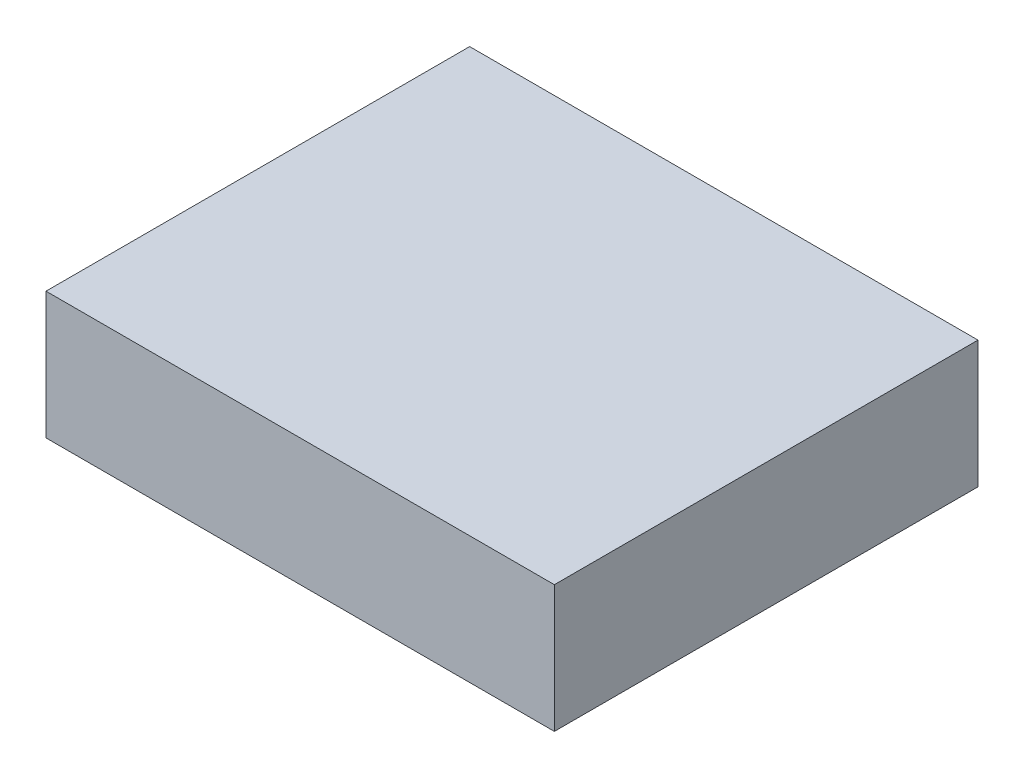
ISO-10303-21;
HEADER;
FILE_DESCRIPTION(('STEP AP214'),'2;1');
FILE_NAME('part.step','',(''),(''),'','','');
FILE_SCHEMA(('AUTOMOTIVE_DESIGN { 1 0 10303 214 1 1 1 1 }'));
ENDSEC;
DATA;
#1=APPLICATION_CONTEXT('core data for automotive mechanical design processes');
#2=APPLICATION_PROTOCOL_DEFINITION('international standard','automotive_design',2000,#1);
#3=PRODUCT_CONTEXT('',#1,'mechanical');
#4=PRODUCT('Part','Part','',(#3));
#5=PRODUCT_RELATED_PRODUCT_CATEGORY('part','',(#4));
#6=PRODUCT_DEFINITION_FORMATION('','',#4);
#7=PRODUCT_DEFINITION_CONTEXT('part definition',#1,'design');
#8=PRODUCT_DEFINITION('design','',#6,#7);
#9=PRODUCT_DEFINITION_SHAPE('','',#8);
#10=(LENGTH_UNIT() NAMED_UNIT(*) SI_UNIT(.MILLI.,.METRE.));
#11=(NAMED_UNIT(*) PLANE_ANGLE_UNIT() SI_UNIT($,.RADIAN.));
#12=(NAMED_UNIT(*) SI_UNIT($,.STERADIAN.) SOLID_ANGLE_UNIT());
#13=UNCERTAINTY_MEASURE_WITH_UNIT(LENGTH_MEASURE(1.E-05),#10,'distance_accuracy_value','');
#14=(GEOMETRIC_REPRESENTATION_CONTEXT(3) GLOBAL_UNCERTAINTY_ASSIGNED_CONTEXT((#13)) GLOBAL_UNIT_ASSIGNED_CONTEXT((#10,
#11,#12)) REPRESENTATION_CONTEXT('',''));
#15=CARTESIAN_POINT('',(0.,0.,0.));
#16=DIRECTION('',(0.,0.,1.));
#17=DIRECTION('',(1.,0.,0.));
#18=AXIS2_PLACEMENT_3D('',#15,#16,#17);
#19=CARTESIAN_POINT('',(-60.,0.,0.));
#20=DIRECTION('',(0.,0.,1.));
#21=DIRECTION('',(0.,-1.,0.));
#22=AXIS2_PLACEMENT_3D('',#19,#20,#21);
#23=PLANE('',#22);
#24=DIRECTION('',(1.,0.,0.));
#25=VECTOR('',#24,1.);
#26=CARTESIAN_POINT('',(-60.,-480.,0.));
#27=LINE('',#26,#25);
#28=CARTESIAN_POINT('',(-60.,-480.,0.));
#29=VERTEX_POINT('',#28);
#30=CARTESIAN_POINT('',(60.,-480.,0.));
#31=VERTEX_POINT('',#30);
#32=EDGE_CURVE('E42',#29,#31,#27,.T.);
#33=ORIENTED_EDGE('',*,*,#32,.T.);
#34=DIRECTION('',(0.,-1.,0.));
#35=VECTOR('',#34,1.);
#36=CARTESIAN_POINT('',(60.,0.,0.));
#37=LINE('',#36,#35);
#38=CARTESIAN_POINT('',(60.,-450.,0.));
#39=VERTEX_POINT('',#38);
#40=EDGE_CURVE('E82',#39,#31,#37,.T.);
#41=ORIENTED_EDGE('',*,*,#40,.F.);
#42=DIRECTION('',(1.,0.,0.));
#43=VECTOR('',#42,1.);
#44=CARTESIAN_POINT('',(-60.,-450.,0.));
#45=LINE('',#44,#43);
#46=CARTESIAN_POINT('',(-60.,-450.,0.));
#47=VERTEX_POINT('',#46);
#48=EDGE_CURVE('E11',#47,#39,#45,.T.);
#49=ORIENTED_EDGE('',*,*,#48,.F.);
#50=DIRECTION('',(0.,-1.,0.));
#51=VECTOR('',#50,1.);
#52=CARTESIAN_POINT('',(-60.,0.,0.));
#53=LINE('',#52,#51);
#54=EDGE_CURVE('E83',#47,#29,#53,.T.);
#55=ORIENTED_EDGE('',*,*,#54,.T.);
#56=EDGE_LOOP('',(#33,#41,#49,#55));
#57=FACE_BOUND('',#56,.T.);
#58=ADVANCED_FACE('F41',(#57),#23,.T.);
#59=CARTESIAN_POINT('',(-60.,-450.,0.));
#60=DIRECTION('',(0.,-1.,0.));
#61=DIRECTION('',(0.,0.,-1.));
#62=AXIS2_PLACEMENT_3D('',#59,#60,#61);
#63=PLANE('',#62);
#64=ORIENTED_EDGE('',*,*,#48,.T.);
#65=DIRECTION('',(0.,0.,-1.));
#66=VECTOR('',#65,1.);
#67=CARTESIAN_POINT('',(60.,-450.,0.));
#68=LINE('',#67,#66);
#69=CARTESIAN_POINT('',(60.,-450.,-100.));
#70=VERTEX_POINT('',#69);
#71=EDGE_CURVE('E97',#39,#70,#68,.T.);
#72=ORIENTED_EDGE('',*,*,#71,.T.);
#73=DIRECTION('',(1.,0.,0.));
#74=VECTOR('',#73,1.);
#75=CARTESIAN_POINT('',(-60.,-450.,-100.));
#76=LINE('',#75,#74);
#77=CARTESIAN_POINT('',(-60.,-450.,-100.));
#78=VERTEX_POINT('',#77);
#79=EDGE_CURVE('E47',#78,#70,#76,.T.);
#80=ORIENTED_EDGE('',*,*,#79,.F.);
#81=DIRECTION('',(0.,0.,-1.));
#82=VECTOR('',#81,1.);
#83=CARTESIAN_POINT('',(-60.,-450.,0.));
#84=LINE('',#83,#82);
#85=EDGE_CURVE('E61',#47,#78,#84,.T.);
#86=ORIENTED_EDGE('',*,*,#85,.F.);
#87=EDGE_LOOP('',(#64,#72,#80,#86));
#88=FACE_BOUND('',#87,.T.);
#89=ADVANCED_FACE('F111',(#88),#63,.F.);
#90=CARTESIAN_POINT('',(-60.,0.,-99.9999999999996));
#91=DIRECTION('',(0.,0.,1.));
#92=DIRECTION('',(0.,-1.,0.));
#93=AXIS2_PLACEMENT_3D('',#90,#91,#92);
#94=PLANE('',#93);
#95=ORIENTED_EDGE('',*,*,#79,.T.);
#96=DIRECTION('',(0.,-1.,0.));
#97=VECTOR('',#96,1.);
#98=CARTESIAN_POINT('',(60.,0.,-99.9999999999996));
#99=LINE('',#98,#97);
#100=CARTESIAN_POINT('',(60.,-480.,-100.));
#101=VERTEX_POINT('',#100);
#102=EDGE_CURVE('E92',#70,#101,#99,.T.);
#103=ORIENTED_EDGE('',*,*,#102,.T.);
#104=DIRECTION('',(1.,0.,0.));
#105=VECTOR('',#104,1.);
#106=CARTESIAN_POINT('',(-60.,-480.,-100.));
#107=LINE('',#106,#105);
#108=CARTESIAN_POINT('',(-60.,-480.,-100.));
#109=VERTEX_POINT('',#108);
#110=EDGE_CURVE('E87',#109,#101,#107,.T.);
#111=ORIENTED_EDGE('',*,*,#110,.F.);
#112=DIRECTION('',(0.,-1.,0.));
#113=VECTOR('',#112,1.);
#114=CARTESIAN_POINT('',(-60.,0.,-99.9999999999996));
#115=LINE('',#114,#113);
#116=EDGE_CURVE('E110',#78,#109,#115,.T.);
#117=ORIENTED_EDGE('',*,*,#116,.F.);
#118=EDGE_LOOP('',(#95,#103,#111,#117));
#119=FACE_BOUND('',#118,.T.);
#120=ADVANCED_FACE('F115',(#119),#94,.F.);
#121=CARTESIAN_POINT('',(-60.,-480.,0.));
#122=DIRECTION('',(0.,-1.,0.));
#123=DIRECTION('',(0.,0.,-1.));
#124=AXIS2_PLACEMENT_3D('',#121,#122,#123);
#125=PLANE('',#124);
#126=ORIENTED_EDGE('',*,*,#110,.T.);
#127=DIRECTION('',(0.,0.,-1.));
#128=VECTOR('',#127,1.);
#129=CARTESIAN_POINT('',(60.,-480.,0.));
#130=LINE('',#129,#128);
#131=EDGE_CURVE('E90',#31,#101,#130,.T.);
#132=ORIENTED_EDGE('',*,*,#131,.F.);
#133=ORIENTED_EDGE('',*,*,#32,.F.);
#134=DIRECTION('',(0.,0.,-1.));
#135=VECTOR('',#134,1.);
#136=CARTESIAN_POINT('',(-60.,-480.,0.));
#137=LINE('',#136,#135);
#138=EDGE_CURVE('E104',#29,#109,#137,.T.);
#139=ORIENTED_EDGE('',*,*,#138,.T.);
#140=EDGE_LOOP('',(#126,#132,#133,#139));
#141=FACE_BOUND('',#140,.T.);
#142=ADVANCED_FACE('F89',(#141),#125,.T.);
#143=CARTESIAN_POINT('',(-60.,0.,0.));
#144=DIRECTION('',(1.,0.,0.));
#145=DIRECTION('',(0.,0.,-1.));
#146=AXIS2_PLACEMENT_3D('',#143,#144,#145);
#147=PLANE('',#146);
#148=ORIENTED_EDGE('',*,*,#54,.F.);
#149=ORIENTED_EDGE('',*,*,#85,.T.);
#150=ORIENTED_EDGE('',*,*,#116,.T.);
#151=ORIENTED_EDGE('',*,*,#138,.F.);
#152=EDGE_LOOP('',(#148,#149,#150,#151));
#153=FACE_BOUND('',#152,.T.);
#154=ADVANCED_FACE('F113',(#153),#147,.F.);
#155=CARTESIAN_POINT('',(60.,0.,0.));
#156=DIRECTION('',(1.,0.,0.));
#157=DIRECTION('',(0.,0.,-1.));
#158=AXIS2_PLACEMENT_3D('',#155,#156,#157);
#159=PLANE('',#158);
#160=ORIENTED_EDGE('',*,*,#40,.T.);
#161=ORIENTED_EDGE('',*,*,#131,.T.);
#162=ORIENTED_EDGE('',*,*,#102,.F.);
#163=ORIENTED_EDGE('',*,*,#71,.F.);
#164=EDGE_LOOP('',(#160,#161,#162,#163));
#165=FACE_BOUND('',#164,.T.);
#166=ADVANCED_FACE('F100',(#165),#159,.T.);
#167=CLOSED_SHELL('',(#58,#89,#120,#142,#154,#166));
#168=MANIFOLD_SOLID_BREP('B2',#167);
#169=ADVANCED_BREP_SHAPE_REPRESENTATION('',(#18,#168),#14);
#170=SHAPE_DEFINITION_REPRESENTATION(#9,#169);
ENDSEC;
END-ISO-10303-21;
